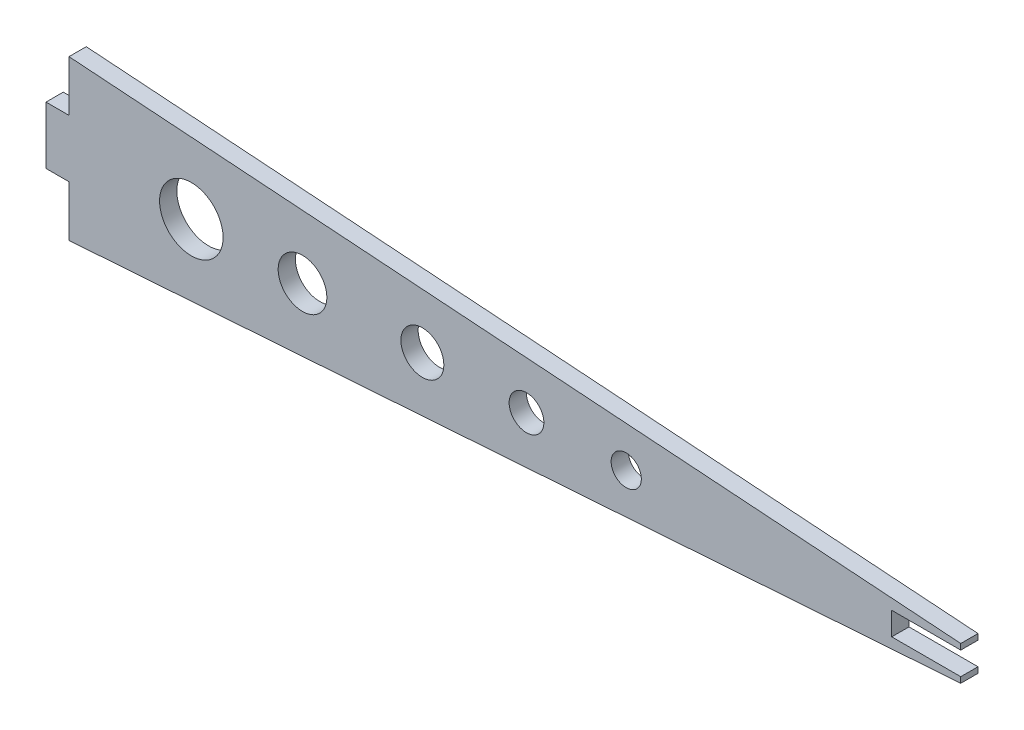
ISO-10303-21;
HEADER;
FILE_DESCRIPTION(('STEP AP214'),'2;1');
FILE_NAME('part.step','',(''),(''),'','','');
FILE_SCHEMA(('AUTOMOTIVE_DESIGN { 1 0 10303 214 1 1 1 1 }'));
ENDSEC;
DATA;
#1=APPLICATION_CONTEXT('core data for automotive mechanical design processes');
#2=APPLICATION_PROTOCOL_DEFINITION('international standard','automotive_design',2000,#1);
#3=PRODUCT_CONTEXT('',#1,'mechanical');
#4=PRODUCT('Part','Part','',(#3));
#5=PRODUCT_RELATED_PRODUCT_CATEGORY('part','',(#4));
#6=PRODUCT_DEFINITION_FORMATION('','',#4);
#7=PRODUCT_DEFINITION_CONTEXT('part definition',#1,'design');
#8=PRODUCT_DEFINITION('design','',#6,#7);
#9=PRODUCT_DEFINITION_SHAPE('','',#8);
#10=(LENGTH_UNIT() NAMED_UNIT(*) SI_UNIT(.MILLI.,.METRE.));
#11=(NAMED_UNIT(*) PLANE_ANGLE_UNIT() SI_UNIT($,.RADIAN.));
#12=(NAMED_UNIT(*) SI_UNIT($,.STERADIAN.) SOLID_ANGLE_UNIT());
#13=UNCERTAINTY_MEASURE_WITH_UNIT(LENGTH_MEASURE(1.E-05),#10,'distance_accuracy_value','');
#14=(GEOMETRIC_REPRESENTATION_CONTEXT(3) GLOBAL_UNCERTAINTY_ASSIGNED_CONTEXT((#13)) GLOBAL_UNIT_ASSIGNED_CONTEXT((#10,
#11,#12)) REPRESENTATION_CONTEXT('',''));
#15=CARTESIAN_POINT('',(0.,0.,0.));
#16=DIRECTION('',(0.,0.,1.));
#17=DIRECTION('',(1.,0.,0.));
#18=AXIS2_PLACEMENT_3D('',#15,#16,#17);
#19=CARTESIAN_POINT('',(0.,0.,1.5));
#20=DIRECTION('',(0.,0.,-1.));
#21=DIRECTION('',(-1.,0.,0.));
#22=AXIS2_PLACEMENT_3D('',#19,#20,#21);
#23=PLANE('',#22);
#24=DIRECTION('',(-2.37541097900721E-06,0.999999999997179,0.));
#25=VECTOR('',#24,1.);
#26=CARTESIAN_POINT('',(244.059422454404,-193.752615775531,1.5));
#27=LINE('',#26,#25);
#28=CARTESIAN_POINT('',(244.05942364211,-194.252615775534,1.5));
#29=VERTEX_POINT('',#28);
#30=CARTESIAN_POINT('',(244.059422454404,-193.752615775531,1.5));
#31=VERTEX_POINT('',#30);
#32=EDGE_CURVE('E178',#29,#31,#27,.T.);
#33=ORIENTED_EDGE('',*,*,#32,.T.);
#34=DIRECTION('',(-1.,0.,0.));
#35=VECTOR('',#34,1.);
#36=CARTESIAN_POINT('',(244.059422454404,-193.752615775531,1.5));
#37=LINE('',#36,#35);
#38=CARTESIAN_POINT('',(238.059420078994,-193.752615775531,1.5));
#39=VERTEX_POINT('',#38);
#40=EDGE_CURVE('E105',#31,#39,#37,.T.);
#41=ORIENTED_EDGE('',*,*,#40,.T.);
#42=DIRECTION('',(0.,1.,0.));
#43=VECTOR('',#42,1.);
#44=CARTESIAN_POINT('',(238.059420078994,-192.752615775534,1.5));
#45=LINE('',#44,#43);
#46=CARTESIAN_POINT('',(238.059420078994,-191.752615775537,1.5));
#47=VERTEX_POINT('',#46);
#48=EDGE_CURVE('E204',#39,#47,#45,.T.);
#49=ORIENTED_EDGE('',*,*,#48,.T.);
#50=DIRECTION('',(1.,0.,0.));
#51=VECTOR('',#50,1.);
#52=CARTESIAN_POINT('',(244.059417703583,-191.752615775537,1.5));
#53=LINE('',#52,#51);
#54=CARTESIAN_POINT('',(244.059417703583,-191.752615775537,1.5));
#55=VERTEX_POINT('',#54);
#56=EDGE_CURVE('E225',#47,#55,#53,.T.);
#57=ORIENTED_EDGE('',*,*,#56,.T.);
#58=DIRECTION('',(-2.37541009082892E-06,0.999999999997179,0.));
#59=VECTOR('',#58,1.);
#60=CARTESIAN_POINT('',(244.059416515878,-191.252615775534,1.5));
#61=LINE('',#60,#59);
#62=CARTESIAN_POINT('',(244.059416515878,-191.252615775534,1.5));
#63=VERTEX_POINT('',#62);
#64=EDGE_CURVE('E222',#55,#63,#61,.T.);
#65=ORIENTED_EDGE('',*,*,#64,.T.);
#66=DIRECTION('',(-0.997564051872407,0.0697564506831148,0.));
#67=VECTOR('',#66,1.);
#68=CARTESIAN_POINT('',(166.526919178435,-185.831017215816,1.5));
#69=LINE('',#68,#67);
#70=CARTESIAN_POINT('',(166.526919178435,-185.831017215816,1.5));
#71=VERTEX_POINT('',#70);
#72=EDGE_CURVE('E224',#63,#71,#69,.T.);
#73=ORIENTED_EDGE('',*,*,#72,.T.);
#74=DIRECTION('',(0.,-1.,0.));
#75=VECTOR('',#74,1.);
#76=CARTESIAN_POINT('',(166.526919178435,-185.831017215816,1.5));
#77=LINE('',#76,#75);
#78=CARTESIAN_POINT('',(166.526919178435,-190.252615775534,1.5));
#79=VERTEX_POINT('',#78);
#80=EDGE_CURVE('E227',#71,#79,#77,.T.);
#81=ORIENTED_EDGE('',*,*,#80,.T.);
#82=DIRECTION('',(-1.,0.,0.));
#83=VECTOR('',#82,1.);
#84=CARTESIAN_POINT('',(164.526919178435,-190.252615775534,1.5));
#85=LINE('',#84,#83);
#86=CARTESIAN_POINT('',(164.526919178435,-190.252615775534,1.5));
#87=VERTEX_POINT('',#86);
#88=EDGE_CURVE('E233',#79,#87,#85,.T.);
#89=ORIENTED_EDGE('',*,*,#88,.T.);
#90=DIRECTION('',(0.,-1.,0.));
#91=VECTOR('',#90,1.);
#92=CARTESIAN_POINT('',(164.526919178435,-195.252615775534,1.5));
#93=LINE('',#92,#91);
#94=CARTESIAN_POINT('',(164.526919178435,-195.252615775534,1.5));
#95=VERTEX_POINT('',#94);
#96=EDGE_CURVE('E136',#87,#95,#93,.T.);
#97=ORIENTED_EDGE('',*,*,#96,.T.);
#98=DIRECTION('',(1.,0.,0.));
#99=VECTOR('',#98,1.);
#100=CARTESIAN_POINT('',(166.526919178435,-195.252615775534,1.5));
#101=LINE('',#100,#99);
#102=CARTESIAN_POINT('',(166.526919178435,-195.252615775534,1.5));
#103=VERTEX_POINT('',#102);
#104=EDGE_CURVE('E130',#95,#103,#101,.T.);
#105=ORIENTED_EDGE('',*,*,#104,.T.);
#106=DIRECTION('',(0.,-1.,0.));
#107=VECTOR('',#106,1.);
#108=CARTESIAN_POINT('',(166.526919178435,-195.252615775534,1.5));
#109=LINE('',#108,#107);
#110=CARTESIAN_POINT('',(166.526919178435,-199.674216634675,1.5));
#111=VERTEX_POINT('',#110);
#112=EDGE_CURVE('E134',#103,#111,#109,.T.);
#113=ORIENTED_EDGE('',*,*,#112,.T.);
#114=DIRECTION('',(0.997564050259824,0.0697564737441266,0.));
#115=VECTOR('',#114,1.);
#116=CARTESIAN_POINT('',(244.05942364211,-194.252615775534,1.5));
#117=LINE('',#116,#115);
#118=EDGE_CURVE('E50',#111,#29,#117,.T.);
#119=ORIENTED_EDGE('',*,*,#118,.T.);
#120=EDGE_LOOP('',(#33,#41,#49,#57,#65,#73,#81,#89,#97,#105,#113,#119));
#121=FACE_BOUND('',#120,.T.);
#122=CARTESIAN_POINT('',(177.162967315489,-192.752615775534,1.5));
#123=DIRECTION('',(0.,0.,1.));
#124=DIRECTION('',(1.,0.,0.));
#125=AXIS2_PLACEMENT_3D('',#122,#123,#124);
#126=CIRCLE('',#125,2.76162655501772);
#127=CARTESIAN_POINT('',(179.924593870507,-192.752615775534,1.5));
#128=VERTEX_POINT('',#127);
#129=EDGE_CURVE('E158',#128,#128,#126,.T.);
#130=ORIENTED_EDGE('',*,*,#129,.F.);
#131=EDGE_LOOP('',(#130));
#132=FACE_BOUND('',#131,.T.);
#133=CARTESIAN_POINT('',(197.250125117854,-192.752615775534,1.5));
#134=DIRECTION('',(0.,0.,1.));
#135=DIRECTION('',(1.,0.,0.));
#136=AXIS2_PLACEMENT_3D('',#133,#134,#135);
#137=CIRCLE('',#136,1.86657166365303);
#138=CARTESIAN_POINT('',(199.116696781507,-192.752615775534,1.5));
#139=VERTEX_POINT('',#138);
#140=EDGE_CURVE('E421',#139,#139,#137,.T.);
#141=ORIENTED_EDGE('',*,*,#140,.F.);
#142=EDGE_LOOP('',(#141));
#143=FACE_BOUND('',#142,.T.);
#144=CARTESIAN_POINT('',(214.974129702641,-192.752615775534,1.5));
#145=DIRECTION('',(0.,0.,1.));
#146=DIRECTION('',(1.,0.,0.));
#147=AXIS2_PLACEMENT_3D('',#144,#145,#146);
#148=CIRCLE('',#147,1.31323414782922);
#149=CARTESIAN_POINT('',(216.28736385047,-192.752615775534,1.5));
#150=VERTEX_POINT('',#149);
#151=EDGE_CURVE('E427',#150,#150,#148,.T.);
#152=ORIENTED_EDGE('',*,*,#151,.F.);
#153=EDGE_LOOP('',(#152));
#154=FACE_BOUND('',#153,.T.);
#155=CARTESIAN_POINT('',(186.829055112204,-192.752615775534,1.5));
#156=DIRECTION('',(0.,0.,1.));
#157=DIRECTION('',(1.,0.,0.));
#158=AXIS2_PLACEMENT_3D('',#155,#156,#157);
#159=CIRCLE('',#158,2.11672271852148);
#160=CARTESIAN_POINT('',(188.945777830726,-192.752615775534,1.5));
#161=VERTEX_POINT('',#160);
#162=EDGE_CURVE('E433',#161,#161,#159,.T.);
#163=ORIENTED_EDGE('',*,*,#162,.F.);
#164=EDGE_LOOP('',(#163));
#165=FACE_BOUND('',#164,.T.);
#166=CARTESIAN_POINT('',(206.302954901577,-192.752615775534,1.5));
#167=DIRECTION('',(0.,0.,1.));
#168=DIRECTION('',(1.,0.,0.));
#169=AXIS2_PLACEMENT_3D('',#166,#167,#168);
#170=CIRCLE('',#169,1.50974299256199);
#171=CARTESIAN_POINT('',(207.812697894139,-192.752615775534,1.5));
#172=VERTEX_POINT('',#171);
#173=EDGE_CURVE('E439',#172,#172,#170,.T.);
#174=ORIENTED_EDGE('',*,*,#173,.F.);
#175=EDGE_LOOP('',(#174));
#176=FACE_BOUND('',#175,.T.);
#177=ADVANCED_FACE('F33',(#121,#132,#143,#154,#165,#176),#23,.F.);
#178=CARTESIAN_POINT('',(0.,0.,0.));
#179=DIRECTION('',(0.,0.,-1.));
#180=DIRECTION('',(-1.,0.,0.));
#181=AXIS2_PLACEMENT_3D('',#178,#179,#180);
#182=PLANE('',#181);
#183=CARTESIAN_POINT('',(186.829055112204,-192.752615775534,0.));
#184=DIRECTION('',(0.,0.,1.));
#185=DIRECTION('',(1.,0.,0.));
#186=AXIS2_PLACEMENT_3D('',#183,#184,#185);
#187=CIRCLE('',#186,2.11672271852148);
#188=CARTESIAN_POINT('',(188.945777830726,-192.752615775534,0.));
#189=VERTEX_POINT('',#188);
#190=EDGE_CURVE('E436',#189,#189,#187,.T.);
#191=ORIENTED_EDGE('',*,*,#190,.T.);
#192=EDGE_LOOP('',(#191));
#193=FACE_BOUND('',#192,.T.);
#194=CARTESIAN_POINT('',(197.250125117854,-192.752615775534,0.));
#195=DIRECTION('',(0.,0.,1.));
#196=DIRECTION('',(1.,0.,0.));
#197=AXIS2_PLACEMENT_3D('',#194,#195,#196);
#198=CIRCLE('',#197,1.86657166365303);
#199=CARTESIAN_POINT('',(199.116696781507,-192.752615775534,0.));
#200=VERTEX_POINT('',#199);
#201=EDGE_CURVE('E424',#200,#200,#198,.T.);
#202=ORIENTED_EDGE('',*,*,#201,.T.);
#203=EDGE_LOOP('',(#202));
#204=FACE_BOUND('',#203,.T.);
#205=DIRECTION('',(-2.37541097900721E-06,0.999999999997179,0.));
#206=VECTOR('',#205,1.);
#207=CARTESIAN_POINT('',(244.059422454404,-193.752615775531,0.));
#208=LINE('',#207,#206);
#209=CARTESIAN_POINT('',(244.05942364211,-194.252615775534,0.));
#210=VERTEX_POINT('',#209);
#211=CARTESIAN_POINT('',(244.059422454404,-193.752615775531,0.));
#212=VERTEX_POINT('',#211);
#213=EDGE_CURVE('E154',#210,#212,#208,.T.);
#214=ORIENTED_EDGE('',*,*,#213,.F.);
#215=DIRECTION('',(0.997564050259824,0.0697564737441266,0.));
#216=VECTOR('',#215,1.);
#217=CARTESIAN_POINT('',(244.05942364211,-194.252615775534,0.));
#218=LINE('',#217,#216);
#219=CARTESIAN_POINT('',(166.526919178435,-199.674216634675,0.));
#220=VERTEX_POINT('',#219);
#221=EDGE_CURVE('E97',#220,#210,#218,.T.);
#222=ORIENTED_EDGE('',*,*,#221,.F.);
#223=DIRECTION('',(0.,-1.,0.));
#224=VECTOR('',#223,1.);
#225=CARTESIAN_POINT('',(166.526919178435,-195.252615775534,0.));
#226=LINE('',#225,#224);
#227=CARTESIAN_POINT('',(166.526919178435,-195.252615775534,0.));
#228=VERTEX_POINT('',#227);
#229=EDGE_CURVE('E91',#228,#220,#226,.T.);
#230=ORIENTED_EDGE('',*,*,#229,.F.);
#231=DIRECTION('',(1.,0.,0.));
#232=VECTOR('',#231,1.);
#233=CARTESIAN_POINT('',(166.526919178435,-195.252615775534,0.));
#234=LINE('',#233,#232);
#235=CARTESIAN_POINT('',(164.526919178435,-195.252615775534,0.));
#236=VERTEX_POINT('',#235);
#237=EDGE_CURVE('E144',#236,#228,#234,.T.);
#238=ORIENTED_EDGE('',*,*,#237,.F.);
#239=DIRECTION('',(0.,-1.,0.));
#240=VECTOR('',#239,1.);
#241=CARTESIAN_POINT('',(164.526919178435,-195.252615775534,0.));
#242=LINE('',#241,#240);
#243=CARTESIAN_POINT('',(164.526919178435,-190.252615775534,0.));
#244=VERTEX_POINT('',#243);
#245=EDGE_CURVE('E173',#244,#236,#242,.T.);
#246=ORIENTED_EDGE('',*,*,#245,.F.);
#247=DIRECTION('',(-1.,0.,0.));
#248=VECTOR('',#247,1.);
#249=CARTESIAN_POINT('',(164.526919178435,-190.252615775534,0.));
#250=LINE('',#249,#248);
#251=CARTESIAN_POINT('',(166.526919178435,-190.252615775534,0.));
#252=VERTEX_POINT('',#251);
#253=EDGE_CURVE('E171',#252,#244,#250,.T.);
#254=ORIENTED_EDGE('',*,*,#253,.F.);
#255=DIRECTION('',(0.,-1.,0.));
#256=VECTOR('',#255,1.);
#257=CARTESIAN_POINT('',(166.526919178435,-185.831017215816,0.));
#258=LINE('',#257,#256);
#259=CARTESIAN_POINT('',(166.526919178435,-185.831017215816,0.));
#260=VERTEX_POINT('',#259);
#261=EDGE_CURVE('E169',#260,#252,#258,.T.);
#262=ORIENTED_EDGE('',*,*,#261,.F.);
#263=DIRECTION('',(-0.997564051872407,0.0697564506831148,0.));
#264=VECTOR('',#263,1.);
#265=CARTESIAN_POINT('',(166.526919178435,-185.831017215816,0.));
#266=LINE('',#265,#264);
#267=CARTESIAN_POINT('',(244.059416515878,-191.252615775534,0.));
#268=VERTEX_POINT('',#267);
#269=EDGE_CURVE('E167',#268,#260,#266,.T.);
#270=ORIENTED_EDGE('',*,*,#269,.F.);
#271=DIRECTION('',(-2.37541009082892E-06,0.999999999997179,0.));
#272=VECTOR('',#271,1.);
#273=CARTESIAN_POINT('',(244.059416515878,-191.252615775534,0.));
#274=LINE('',#273,#272);
#275=CARTESIAN_POINT('',(244.059417703583,-191.752615775537,0.));
#276=VERTEX_POINT('',#275);
#277=EDGE_CURVE('E165',#276,#268,#274,.T.);
#278=ORIENTED_EDGE('',*,*,#277,.F.);
#279=DIRECTION('',(1.,0.,0.));
#280=VECTOR('',#279,1.);
#281=CARTESIAN_POINT('',(244.059417703583,-191.752615775537,0.));
#282=LINE('',#281,#280);
#283=CARTESIAN_POINT('',(238.059420078994,-191.752615775537,0.));
#284=VERTEX_POINT('',#283);
#285=EDGE_CURVE('E163',#284,#276,#282,.T.);
#286=ORIENTED_EDGE('',*,*,#285,.F.);
#287=DIRECTION('',(0.,1.,0.));
#288=VECTOR('',#287,1.);
#289=CARTESIAN_POINT('',(238.059420078994,-192.752615775534,0.));
#290=LINE('',#289,#288);
#291=CARTESIAN_POINT('',(238.059420078994,-193.752615775531,0.));
#292=VERTEX_POINT('',#291);
#293=EDGE_CURVE('E161',#292,#284,#290,.T.);
#294=ORIENTED_EDGE('',*,*,#293,.F.);
#295=DIRECTION('',(-1.,0.,0.));
#296=VECTOR('',#295,1.);
#297=CARTESIAN_POINT('',(244.059422454404,-193.752615775531,0.));
#298=LINE('',#297,#296);
#299=EDGE_CURVE('E157',#212,#292,#298,.T.);
#300=ORIENTED_EDGE('',*,*,#299,.F.);
#301=EDGE_LOOP('',(#214,#222,#230,#238,#246,#254,#262,#270,#278,#286,#294,#300));
#302=FACE_BOUND('',#301,.T.);
#303=CARTESIAN_POINT('',(177.162967315489,-192.752615775534,0.));
#304=DIRECTION('',(0.,0.,1.));
#305=DIRECTION('',(1.,0.,0.));
#306=AXIS2_PLACEMENT_3D('',#303,#304,#305);
#307=CIRCLE('',#306,2.76162655501772);
#308=CARTESIAN_POINT('',(179.924593870507,-192.752615775534,0.));
#309=VERTEX_POINT('',#308);
#310=EDGE_CURVE('E418',#309,#309,#307,.T.);
#311=ORIENTED_EDGE('',*,*,#310,.T.);
#312=EDGE_LOOP('',(#311));
#313=FACE_BOUND('',#312,.T.);
#314=CARTESIAN_POINT('',(214.974129702641,-192.752615775534,0.));
#315=DIRECTION('',(0.,0.,1.));
#316=DIRECTION('',(1.,0.,0.));
#317=AXIS2_PLACEMENT_3D('',#314,#315,#316);
#318=CIRCLE('',#317,1.31323414782922);
#319=CARTESIAN_POINT('',(216.28736385047,-192.752615775534,0.));
#320=VERTEX_POINT('',#319);
#321=EDGE_CURVE('E430',#320,#320,#318,.T.);
#322=ORIENTED_EDGE('',*,*,#321,.T.);
#323=EDGE_LOOP('',(#322));
#324=FACE_BOUND('',#323,.T.);
#325=CARTESIAN_POINT('',(206.302954901577,-192.752615775534,0.));
#326=DIRECTION('',(0.,0.,1.));
#327=DIRECTION('',(1.,0.,0.));
#328=AXIS2_PLACEMENT_3D('',#325,#326,#327);
#329=CIRCLE('',#328,1.50974299256199);
#330=CARTESIAN_POINT('',(207.812697894139,-192.752615775534,0.));
#331=VERTEX_POINT('',#330);
#332=EDGE_CURVE('E442',#331,#331,#329,.T.);
#333=ORIENTED_EDGE('',*,*,#332,.T.);
#334=EDGE_LOOP('',(#333));
#335=FACE_BOUND('',#334,.T.);
#336=ADVANCED_FACE('F209',(#193,#204,#302,#313,#324,#335),#182,.T.);
#337=CARTESIAN_POINT('',(244.059422454404,-193.752615775531,1.5));
#338=DIRECTION('',(-0.999999999997179,-2.37541097900721E-06,0.));
#339=DIRECTION('',(2.37541097900721E-06,-0.999999999997179,0.));
#340=AXIS2_PLACEMENT_3D('',#337,#338,#339);
#341=PLANE('',#340);
#342=ORIENTED_EDGE('',*,*,#213,.T.);
#343=DIRECTION('',(0.,0.,-1.));
#344=VECTOR('',#343,1.);
#345=CARTESIAN_POINT('',(244.059422454404,-193.752615775531,1.5));
#346=LINE('',#345,#344);
#347=EDGE_CURVE('E11',#31,#212,#346,.T.);
#348=ORIENTED_EDGE('',*,*,#347,.F.);
#349=ORIENTED_EDGE('',*,*,#32,.F.);
#350=DIRECTION('',(0.,0.,-1.));
#351=VECTOR('',#350,1.);
#352=CARTESIAN_POINT('',(244.05942364211,-194.252615775534,1.5));
#353=LINE('',#352,#351);
#354=EDGE_CURVE('E150',#29,#210,#353,.T.);
#355=ORIENTED_EDGE('',*,*,#354,.T.);
#356=EDGE_LOOP('',(#342,#348,#349,#355));
#357=FACE_BOUND('',#356,.T.);
#358=ADVANCED_FACE('F35',(#357),#341,.F.);
#359=CARTESIAN_POINT('',(244.059422454404,-193.752615775531,1.5));
#360=DIRECTION('',(0.,-1.,0.));
#361=DIRECTION('',(0.,0.,-1.));
#362=AXIS2_PLACEMENT_3D('',#359,#360,#361);
#363=PLANE('',#362);
#364=ORIENTED_EDGE('',*,*,#299,.T.);
#365=DIRECTION('',(0.,0.,-1.));
#366=VECTOR('',#365,1.);
#367=CARTESIAN_POINT('',(238.059420078994,-193.752615775531,1.5));
#368=LINE('',#367,#366);
#369=EDGE_CURVE('E42',#39,#292,#368,.T.);
#370=ORIENTED_EDGE('',*,*,#369,.F.);
#371=ORIENTED_EDGE('',*,*,#40,.F.);
#372=ORIENTED_EDGE('',*,*,#347,.T.);
#373=EDGE_LOOP('',(#364,#370,#371,#372));
#374=FACE_BOUND('',#373,.T.);
#375=ADVANCED_FACE('F205',(#374),#363,.F.);
#376=CARTESIAN_POINT('',(238.059420078994,-192.752615775534,1.5));
#377=DIRECTION('',(-1.,0.,0.));
#378=DIRECTION('',(0.,0.,1.));
#379=AXIS2_PLACEMENT_3D('',#376,#377,#378);
#380=PLANE('',#379);
#381=ORIENTED_EDGE('',*,*,#293,.T.);
#382=DIRECTION('',(0.,0.,-1.));
#383=VECTOR('',#382,1.);
#384=CARTESIAN_POINT('',(238.059420078994,-191.752615775537,1.5));
#385=LINE('',#384,#383);
#386=EDGE_CURVE('E197',#47,#284,#385,.T.);
#387=ORIENTED_EDGE('',*,*,#386,.F.);
#388=ORIENTED_EDGE('',*,*,#48,.F.);
#389=ORIENTED_EDGE('',*,*,#369,.T.);
#390=EDGE_LOOP('',(#381,#387,#388,#389));
#391=FACE_BOUND('',#390,.T.);
#392=ADVANCED_FACE('F202',(#391),#380,.F.);
#393=CARTESIAN_POINT('',(244.059417703583,-191.752615775537,1.5));
#394=DIRECTION('',(0.,1.,0.));
#395=DIRECTION('',(0.,0.,1.));
#396=AXIS2_PLACEMENT_3D('',#393,#394,#395);
#397=PLANE('',#396);
#398=ORIENTED_EDGE('',*,*,#285,.T.);
#399=DIRECTION('',(0.,0.,-1.));
#400=VECTOR('',#399,1.);
#401=CARTESIAN_POINT('',(244.059417703583,-191.752615775537,1.5));
#402=LINE('',#401,#400);
#403=EDGE_CURVE('E194',#55,#276,#402,.T.);
#404=ORIENTED_EDGE('',*,*,#403,.F.);
#405=ORIENTED_EDGE('',*,*,#56,.F.);
#406=ORIENTED_EDGE('',*,*,#386,.T.);
#407=EDGE_LOOP('',(#398,#404,#405,#406));
#408=FACE_BOUND('',#407,.T.);
#409=ADVANCED_FACE('F216',(#408),#397,.F.);
#410=CARTESIAN_POINT('',(244.059416515878,-191.252615775534,1.5));
#411=DIRECTION('',(-0.999999999997179,-2.37541009082892E-06,0.));
#412=DIRECTION('',(2.37541009082892E-06,-0.999999999997179,0.));
#413=AXIS2_PLACEMENT_3D('',#410,#411,#412);
#414=PLANE('',#413);
#415=ORIENTED_EDGE('',*,*,#277,.T.);
#416=DIRECTION('',(0.,0.,-1.));
#417=VECTOR('',#416,1.);
#418=CARTESIAN_POINT('',(244.059416515878,-191.252615775534,1.5));
#419=LINE('',#418,#417);
#420=EDGE_CURVE('E191',#63,#268,#419,.T.);
#421=ORIENTED_EDGE('',*,*,#420,.F.);
#422=ORIENTED_EDGE('',*,*,#64,.F.);
#423=ORIENTED_EDGE('',*,*,#403,.T.);
#424=EDGE_LOOP('',(#415,#421,#422,#423));
#425=FACE_BOUND('',#424,.T.);
#426=ADVANCED_FACE('F220',(#425),#414,.F.);
#427=CARTESIAN_POINT('',(166.526919178435,-185.831017215816,1.5));
#428=DIRECTION('',(-0.0697564506831148,-0.997564051872407,0.));
#429=DIRECTION('',(0.997564051872407,-0.0697564506831148,0.));
#430=AXIS2_PLACEMENT_3D('',#427,#428,#429);
#431=PLANE('',#430);
#432=ORIENTED_EDGE('',*,*,#269,.T.);
#433=DIRECTION('',(0.,0.,-1.));
#434=VECTOR('',#433,1.);
#435=CARTESIAN_POINT('',(166.526919178435,-185.831017215816,1.5));
#436=LINE('',#435,#434);
#437=EDGE_CURVE('E188',#71,#260,#436,.T.);
#438=ORIENTED_EDGE('',*,*,#437,.F.);
#439=ORIENTED_EDGE('',*,*,#72,.F.);
#440=ORIENTED_EDGE('',*,*,#420,.T.);
#441=EDGE_LOOP('',(#432,#438,#439,#440));
#442=FACE_BOUND('',#441,.T.);
#443=ADVANCED_FACE('F249',(#442),#431,.F.);
#444=CARTESIAN_POINT('',(166.526919178435,-185.831017215816,1.5));
#445=DIRECTION('',(1.,0.,0.));
#446=DIRECTION('',(0.,0.,-1.));
#447=AXIS2_PLACEMENT_3D('',#444,#445,#446);
#448=PLANE('',#447);
#449=ORIENTED_EDGE('',*,*,#261,.T.);
#450=DIRECTION('',(0.,0.,-1.));
#451=VECTOR('',#450,1.);
#452=CARTESIAN_POINT('',(166.526919178435,-190.252615775534,1.5));
#453=LINE('',#452,#451);
#454=EDGE_CURVE('E185',#79,#252,#453,.T.);
#455=ORIENTED_EDGE('',*,*,#454,.F.);
#456=ORIENTED_EDGE('',*,*,#80,.F.);
#457=ORIENTED_EDGE('',*,*,#437,.T.);
#458=EDGE_LOOP('',(#449,#455,#456,#457));
#459=FACE_BOUND('',#458,.T.);
#460=ADVANCED_FACE('F246',(#459),#448,.F.);
#461=CARTESIAN_POINT('',(164.526919178435,-190.252615775534,1.5));
#462=DIRECTION('',(0.,-1.,0.));
#463=DIRECTION('',(0.,0.,-1.));
#464=AXIS2_PLACEMENT_3D('',#461,#462,#463);
#465=PLANE('',#464);
#466=ORIENTED_EDGE('',*,*,#253,.T.);
#467=DIRECTION('',(0.,0.,-1.));
#468=VECTOR('',#467,1.);
#469=CARTESIAN_POINT('',(164.526919178435,-190.252615775534,1.5));
#470=LINE('',#469,#468);
#471=EDGE_CURVE('E182',#87,#244,#470,.T.);
#472=ORIENTED_EDGE('',*,*,#471,.F.);
#473=ORIENTED_EDGE('',*,*,#88,.F.);
#474=ORIENTED_EDGE('',*,*,#454,.T.);
#475=EDGE_LOOP('',(#466,#472,#473,#474));
#476=FACE_BOUND('',#475,.T.);
#477=ADVANCED_FACE('F239',(#476),#465,.F.);
#478=CARTESIAN_POINT('',(164.526919178435,-195.252615775534,1.5));
#479=DIRECTION('',(1.,0.,0.));
#480=DIRECTION('',(0.,0.,-1.));
#481=AXIS2_PLACEMENT_3D('',#478,#479,#480);
#482=PLANE('',#481);
#483=ORIENTED_EDGE('',*,*,#245,.T.);
#484=DIRECTION('',(0.,0.,-1.));
#485=VECTOR('',#484,1.);
#486=CARTESIAN_POINT('',(164.526919178435,-195.252615775534,1.5));
#487=LINE('',#486,#485);
#488=EDGE_CURVE('E145',#95,#236,#487,.T.);
#489=ORIENTED_EDGE('',*,*,#488,.F.);
#490=ORIENTED_EDGE('',*,*,#96,.F.);
#491=ORIENTED_EDGE('',*,*,#471,.T.);
#492=EDGE_LOOP('',(#483,#489,#490,#491));
#493=FACE_BOUND('',#492,.T.);
#494=ADVANCED_FACE('F243',(#493),#482,.F.);
#495=CARTESIAN_POINT('',(166.526919178435,-195.252615775534,1.5));
#496=DIRECTION('',(0.,1.,0.));
#497=DIRECTION('',(0.,0.,1.));
#498=AXIS2_PLACEMENT_3D('',#495,#496,#497);
#499=PLANE('',#498);
#500=ORIENTED_EDGE('',*,*,#237,.T.);
#501=DIRECTION('',(0.,0.,-1.));
#502=VECTOR('',#501,1.);
#503=CARTESIAN_POINT('',(166.526919178435,-195.252615775534,1.5));
#504=LINE('',#503,#502);
#505=EDGE_CURVE('E141',#103,#228,#504,.T.);
#506=ORIENTED_EDGE('',*,*,#505,.F.);
#507=ORIENTED_EDGE('',*,*,#104,.F.);
#508=ORIENTED_EDGE('',*,*,#488,.T.);
#509=EDGE_LOOP('',(#500,#506,#507,#508));
#510=FACE_BOUND('',#509,.T.);
#511=ADVANCED_FACE('F142',(#510),#499,.F.);
#512=CARTESIAN_POINT('',(166.526919178435,-195.252615775534,1.5));
#513=DIRECTION('',(1.,0.,0.));
#514=DIRECTION('',(0.,0.,-1.));
#515=AXIS2_PLACEMENT_3D('',#512,#513,#514);
#516=PLANE('',#515);
#517=ORIENTED_EDGE('',*,*,#229,.T.);
#518=DIRECTION('',(0.,0.,-1.));
#519=VECTOR('',#518,1.);
#520=CARTESIAN_POINT('',(166.526919178435,-199.674216634675,1.5));
#521=LINE('',#520,#519);
#522=EDGE_CURVE('E146',#111,#220,#521,.T.);
#523=ORIENTED_EDGE('',*,*,#522,.F.);
#524=ORIENTED_EDGE('',*,*,#112,.F.);
#525=ORIENTED_EDGE('',*,*,#505,.T.);
#526=EDGE_LOOP('',(#517,#523,#524,#525));
#527=FACE_BOUND('',#526,.T.);
#528=ADVANCED_FACE('F148',(#527),#516,.F.);
#529=CARTESIAN_POINT('',(244.05942364211,-194.252615775534,1.5));
#530=DIRECTION('',(-0.0697564737441266,0.997564050259824,0.));
#531=DIRECTION('',(-0.997564050259824,-0.0697564737441266,0.));
#532=AXIS2_PLACEMENT_3D('',#529,#530,#531);
#533=PLANE('',#532);
#534=ORIENTED_EDGE('',*,*,#221,.T.);
#535=ORIENTED_EDGE('',*,*,#354,.F.);
#536=ORIENTED_EDGE('',*,*,#118,.F.);
#537=ORIENTED_EDGE('',*,*,#522,.T.);
#538=EDGE_LOOP('',(#534,#535,#536,#537));
#539=FACE_BOUND('',#538,.T.);
#540=ADVANCED_FACE('F269',(#539),#533,.F.);
#541=CARTESIAN_POINT('',(177.162967315489,-192.752615775534,1.5));
#542=DIRECTION('',(0.,0.,-1.));
#543=DIRECTION('',(-1.,0.,0.));
#544=AXIS2_PLACEMENT_3D('',#541,#542,#543);
#545=CYLINDRICAL_SURFACE('',#544,2.76162655501772);
#546=ORIENTED_EDGE('',*,*,#129,.T.);
#547=EDGE_LOOP('',(#546));
#548=FACE_BOUND('',#547,.T.);
#549=ORIENTED_EDGE('',*,*,#310,.F.);
#550=EDGE_LOOP('',(#549));
#551=FACE_BOUND('',#550,.T.);
#552=ADVANCED_FACE('F266',(#548,#551),#545,.F.);
#553=CARTESIAN_POINT('',(197.250125117854,-192.752615775534,1.5));
#554=DIRECTION('',(0.,0.,-1.));
#555=DIRECTION('',(-1.,0.,0.));
#556=AXIS2_PLACEMENT_3D('',#553,#554,#555);
#557=CYLINDRICAL_SURFACE('',#556,1.86657166365303);
#558=ORIENTED_EDGE('',*,*,#140,.T.);
#559=EDGE_LOOP('',(#558));
#560=FACE_BOUND('',#559,.T.);
#561=ORIENTED_EDGE('',*,*,#201,.F.);
#562=EDGE_LOOP('',(#561));
#563=FACE_BOUND('',#562,.T.);
#564=ADVANCED_FACE('F305',(#560,#563),#557,.F.);
#565=CARTESIAN_POINT('',(214.974129702641,-192.752615775534,1.5));
#566=DIRECTION('',(0.,0.,-1.));
#567=DIRECTION('',(-1.,0.,0.));
#568=AXIS2_PLACEMENT_3D('',#565,#566,#567);
#569=CYLINDRICAL_SURFACE('',#568,1.31323414782922);
#570=ORIENTED_EDGE('',*,*,#151,.T.);
#571=EDGE_LOOP('',(#570));
#572=FACE_BOUND('',#571,.T.);
#573=ORIENTED_EDGE('',*,*,#321,.F.);
#574=EDGE_LOOP('',(#573));
#575=FACE_BOUND('',#574,.T.);
#576=ADVANCED_FACE('F312',(#572,#575),#569,.F.);
#577=CARTESIAN_POINT('',(186.829055112204,-192.752615775534,1.5));
#578=DIRECTION('',(0.,0.,-1.));
#579=DIRECTION('',(-1.,0.,0.));
#580=AXIS2_PLACEMENT_3D('',#577,#578,#579);
#581=CYLINDRICAL_SURFACE('',#580,2.11672271852148);
#582=ORIENTED_EDGE('',*,*,#162,.T.);
#583=EDGE_LOOP('',(#582));
#584=FACE_BOUND('',#583,.T.);
#585=ORIENTED_EDGE('',*,*,#190,.F.);
#586=EDGE_LOOP('',(#585));
#587=FACE_BOUND('',#586,.T.);
#588=ADVANCED_FACE('F319',(#584,#587),#581,.F.);
#589=CARTESIAN_POINT('',(206.302954901577,-192.752615775534,1.5));
#590=DIRECTION('',(0.,0.,-1.));
#591=DIRECTION('',(-1.,0.,0.));
#592=AXIS2_PLACEMENT_3D('',#589,#590,#591);
#593=CYLINDRICAL_SURFACE('',#592,1.50974299256199);
#594=ORIENTED_EDGE('',*,*,#173,.T.);
#595=EDGE_LOOP('',(#594));
#596=FACE_BOUND('',#595,.T.);
#597=ORIENTED_EDGE('',*,*,#332,.F.);
#598=EDGE_LOOP('',(#597));
#599=FACE_BOUND('',#598,.T.);
#600=ADVANCED_FACE('F327',(#596,#599),#593,.F.);
#601=CLOSED_SHELL('',(#177,#336,#358,#375,#392,#409,#426,#443,#460,#477,#494,#511,#528,#540,
#552,#564,#576,#588,#600));
#602=MANIFOLD_SOLID_BREP('B2',#601);
#603=ADVANCED_BREP_SHAPE_REPRESENTATION('',(#18,#602),#14);
#604=SHAPE_DEFINITION_REPRESENTATION(#9,#603);
ENDSEC;
END-ISO-10303-21;
